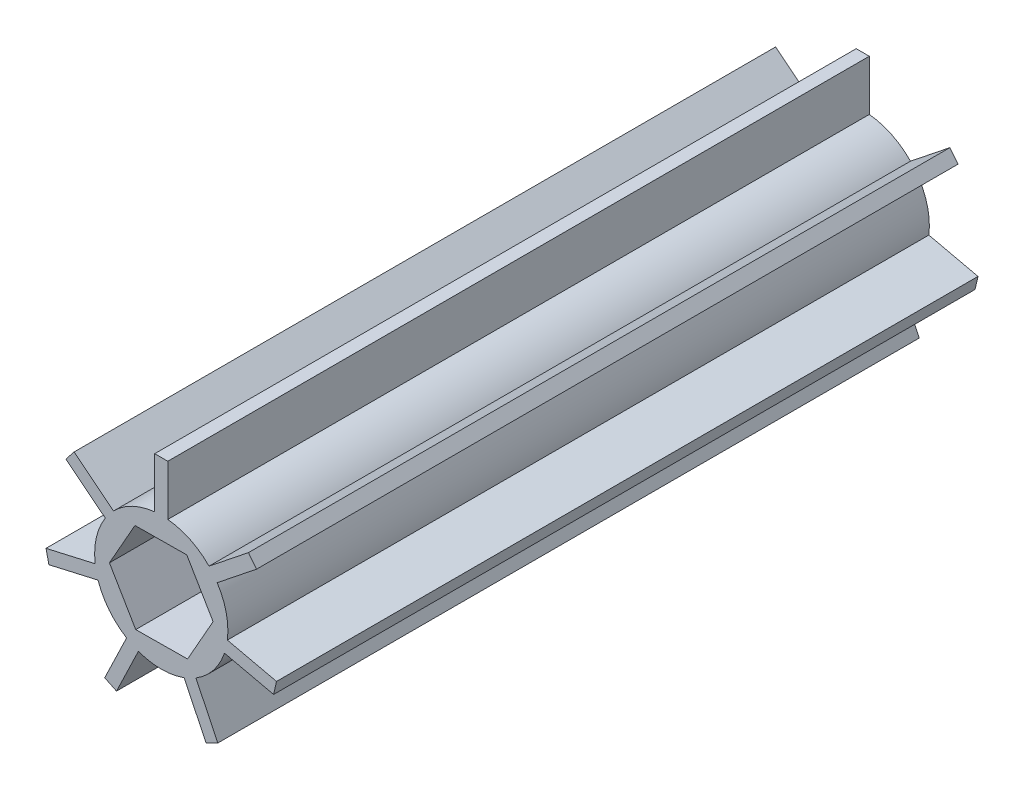
ISO-10303-21;
HEADER;
FILE_DESCRIPTION(('STEP AP214'),'2;1');
FILE_NAME('part.step','',(''),(''),'','','');
FILE_SCHEMA(('AUTOMOTIVE_DESIGN { 1 0 10303 214 1 1 1 1 }'));
ENDSEC;
DATA;
#1=APPLICATION_CONTEXT('core data for automotive mechanical design processes');
#2=APPLICATION_PROTOCOL_DEFINITION('international standard','automotive_design',2000,#1);
#3=PRODUCT_CONTEXT('',#1,'mechanical');
#4=PRODUCT('Part','Part','',(#3));
#5=PRODUCT_RELATED_PRODUCT_CATEGORY('part','',(#4));
#6=PRODUCT_DEFINITION_FORMATION('','',#4);
#7=PRODUCT_DEFINITION_CONTEXT('part definition',#1,'design');
#8=PRODUCT_DEFINITION('design','',#6,#7);
#9=PRODUCT_DEFINITION_SHAPE('','',#8);
#10=(LENGTH_UNIT() NAMED_UNIT(*) SI_UNIT(.MILLI.,.METRE.));
#11=(NAMED_UNIT(*) PLANE_ANGLE_UNIT() SI_UNIT($,.RADIAN.));
#12=(NAMED_UNIT(*) SI_UNIT($,.STERADIAN.) SOLID_ANGLE_UNIT());
#13=UNCERTAINTY_MEASURE_WITH_UNIT(LENGTH_MEASURE(1.E-05),#10,'distance_accuracy_value','');
#14=(GEOMETRIC_REPRESENTATION_CONTEXT(3) GLOBAL_UNCERTAINTY_ASSIGNED_CONTEXT((#13)) GLOBAL_UNIT_ASSIGNED_CONTEXT((#10,
#11,#12)) REPRESENTATION_CONTEXT('',''));
#15=CARTESIAN_POINT('',(0.,0.,0.));
#16=DIRECTION('',(0.,0.,1.));
#17=DIRECTION('',(1.,0.,0.));
#18=AXIS2_PLACEMENT_3D('',#15,#16,#17);
#19=CARTESIAN_POINT('',(0.,0.,-76.2));
#20=DIRECTION('',(0.,0.,1.));
#21=DIRECTION('',(1.,0.,0.));
#22=AXIS2_PLACEMENT_3D('',#19,#20,#21);
#23=CYLINDRICAL_SURFACE('',#22,7.239);
#24=DIRECTION('',(0.,0.,1.));
#25=VECTOR('',#24,1.);
#26=CARTESIAN_POINT('',(-5.1888717496062,5.04764608170369,-76.2));
#27=LINE('',#26,#25);
#28=CARTESIAN_POINT('',(-5.18887174960621,5.04764608170369,0.));
#29=VERTEX_POINT('',#28);
#30=CARTESIAN_POINT('',(-5.18887174960621,5.04764608170369,-76.2));
#31=VERTEX_POINT('',#30);
#32=EDGE_CURVE('E11',#29,#31,#27,.F.);
#33=ORIENTED_EDGE('',*,*,#32,.F.);
#34=CARTESIAN_POINT('',(0.,0.,0.));
#35=DIRECTION('',(0.,0.,1.));
#36=DIRECTION('',(1.,0.,0.));
#37=AXIS2_PLACEMENT_3D('',#34,#35,#36);
#38=CIRCLE('',#37,7.239);
#39=CARTESIAN_POINT('',(-0.7112,7.20397914766555,0.));
#40=VERTEX_POINT('',#39);
#41=EDGE_CURVE('E442',#40,#29,#38,.T.);
#42=ORIENTED_EDGE('',*,*,#41,.F.);
#43=DIRECTION('',(0.,0.,1.));
#44=VECTOR('',#43,1.);
#45=CARTESIAN_POINT('',(-0.7112,7.20397914766554,-76.2));
#46=LINE('',#45,#44);
#47=CARTESIAN_POINT('',(-0.7112,7.20397914766555,-76.2));
#48=VERTEX_POINT('',#47);
#49=EDGE_CURVE('E439',#40,#48,#46,.F.);
#50=ORIENTED_EDGE('',*,*,#49,.T.);
#51=CARTESIAN_POINT('',(0.,0.,-76.2));
#52=DIRECTION('',(0.,0.,1.));
#53=DIRECTION('',(1.,0.,0.));
#54=AXIS2_PLACEMENT_3D('',#51,#52,#53);
#55=CIRCLE('',#54,7.239);
#56=EDGE_CURVE('E436',#48,#31,#55,.T.);
#57=ORIENTED_EDGE('',*,*,#56,.T.);
#58=EDGE_LOOP('',(#33,#42,#50,#57));
#59=FACE_BOUND('',#58,.T.);
#60=ADVANCED_FACE('F39',(#59),#23,.T.);
#61=DIRECTION('',(0.,0.,1.));
#62=VECTOR('',#61,1.);
#63=CARTESIAN_POINT('',(-6.07572364377006,3.93556898104116,-76.2));
#64=LINE('',#63,#62);
#65=CARTESIAN_POINT('',(-6.07572364377007,3.93556898104116,-76.2));
#66=VERTEX_POINT('',#65);
#67=CARTESIAN_POINT('',(-6.07572364377007,3.93556898104116,0.));
#68=VERTEX_POINT('',#67);
#69=EDGE_CURVE('E47',#66,#68,#64,.T.);
#70=ORIENTED_EDGE('',*,*,#69,.F.);
#71=CARTESIAN_POINT('',(-7.18161723806469,-0.909667436996666,-76.2));
#72=VERTEX_POINT('',#71);
#73=EDGE_CURVE('E440',#66,#72,#55,.T.);
#74=ORIENTED_EDGE('',*,*,#73,.T.);
#75=DIRECTION('',(0.,0.,1.));
#76=VECTOR('',#75,1.);
#77=CARTESIAN_POINT('',(-7.18161723806469,-0.909667436996666,-76.2));
#78=LINE('',#77,#76);
#79=CARTESIAN_POINT('',(-7.18161723806469,-0.909667436996666,0.));
#80=VERTEX_POINT('',#79);
#81=EDGE_CURVE('E498',#80,#72,#78,.F.);
#82=ORIENTED_EDGE('',*,*,#81,.F.);
#83=EDGE_CURVE('E445',#68,#80,#38,.T.);
#84=ORIENTED_EDGE('',*,*,#83,.F.);
#85=EDGE_LOOP('',(#70,#74,#82,#84));
#86=FACE_BOUND('',#85,.T.);
#87=ADVANCED_FACE('F510',(#86),#23,.T.);
#88=DIRECTION('',(0.,0.,1.));
#89=VECTOR('',#88,1.);
#90=CARTESIAN_POINT('',(-6.86510346160522,-2.29640489928409,-76.2));
#91=LINE('',#90,#89);
#92=CARTESIAN_POINT('',(-6.86510346160522,-2.29640489928409,-76.2));
#93=VERTEX_POINT('',#92);
#94=CARTESIAN_POINT('',(-6.86510346160522,-2.29640489928409,0.));
#95=VERTEX_POINT('',#94);
#96=EDGE_CURVE('E495',#93,#95,#91,.T.);
#97=ORIENTED_EDGE('',*,*,#96,.F.);
#98=CARTESIAN_POINT('',(-3.76645846796621,-6.18198282180448,-76.2));
#99=VERTEX_POINT('',#98);
#100=EDGE_CURVE('E557',#93,#99,#55,.T.);
#101=ORIENTED_EDGE('',*,*,#100,.T.);
#102=DIRECTION('',(0.,0.,1.));
#103=VECTOR('',#102,1.);
#104=CARTESIAN_POINT('',(-3.76645846796621,-6.18198282180448,-76.2));
#105=LINE('',#104,#103);
#106=CARTESIAN_POINT('',(-3.76645846796621,-6.18198282180448,0.));
#107=VERTEX_POINT('',#106);
#108=EDGE_CURVE('E492',#107,#99,#105,.F.);
#109=ORIENTED_EDGE('',*,*,#108,.F.);
#110=EDGE_CURVE('E513',#95,#107,#38,.T.);
#111=ORIENTED_EDGE('',*,*,#110,.F.);
#112=EDGE_LOOP('',(#97,#101,#109,#111));
#113=FACE_BOUND('',#112,.T.);
#114=ADVANCED_FACE('F597',(#113),#23,.T.);
#115=DIRECTION('',(0.,0.,1.));
#116=VECTOR('',#115,1.);
#117=CARTESIAN_POINT('',(-2.4849203502618,-6.79913905232528,-76.2));
#118=LINE('',#117,#116);
#119=CARTESIAN_POINT('',(-2.4849203502618,-6.79913905232528,-76.2));
#120=VERTEX_POINT('',#119);
#121=CARTESIAN_POINT('',(-2.4849203502618,-6.79913905232528,0.));
#122=VERTEX_POINT('',#121);
#123=EDGE_CURVE('E489',#120,#122,#118,.T.);
#124=ORIENTED_EDGE('',*,*,#123,.F.);
#125=CARTESIAN_POINT('',(2.4849203502619,-6.79913905232525,-76.2));
#126=VERTEX_POINT('',#125);
#127=EDGE_CURVE('E558',#120,#126,#55,.T.);
#128=ORIENTED_EDGE('',*,*,#127,.T.);
#129=DIRECTION('',(0.,0.,1.));
#130=VECTOR('',#129,1.);
#131=CARTESIAN_POINT('',(2.4849203502619,-6.79913905232525,-76.2));
#132=LINE('',#131,#130);
#133=CARTESIAN_POINT('',(2.4849203502619,-6.79913905232525,0.));
#134=VERTEX_POINT('',#133);
#135=EDGE_CURVE('E486',#134,#126,#132,.F.);
#136=ORIENTED_EDGE('',*,*,#135,.F.);
#137=EDGE_CURVE('E515',#122,#134,#38,.T.);
#138=ORIENTED_EDGE('',*,*,#137,.F.);
#139=EDGE_LOOP('',(#124,#128,#136,#138));
#140=FACE_BOUND('',#139,.T.);
#141=ADVANCED_FACE('F612',(#140),#23,.T.);
#142=DIRECTION('',(0.,0.,1.));
#143=VECTOR('',#142,1.);
#144=CARTESIAN_POINT('',(3.7664584679663,-6.18198282180442,-76.2));
#145=LINE('',#144,#143);
#146=CARTESIAN_POINT('',(3.7664584679663,-6.18198282180442,-76.2));
#147=VERTEX_POINT('',#146);
#148=CARTESIAN_POINT('',(3.7664584679663,-6.18198282180442,0.));
#149=VERTEX_POINT('',#148);
#150=EDGE_CURVE('E483',#147,#149,#145,.T.);
#151=ORIENTED_EDGE('',*,*,#150,.F.);
#152=CARTESIAN_POINT('',(6.86510346160525,-2.296404899284,-76.2));
#153=VERTEX_POINT('',#152);
#154=EDGE_CURVE('E561',#147,#153,#55,.T.);
#155=ORIENTED_EDGE('',*,*,#154,.T.);
#156=DIRECTION('',(0.,0.,1.));
#157=VECTOR('',#156,1.);
#158=CARTESIAN_POINT('',(6.86510346160525,-2.296404899284,-76.2));
#159=LINE('',#158,#157);
#160=CARTESIAN_POINT('',(6.86510346160525,-2.296404899284,0.));
#161=VERTEX_POINT('',#160);
#162=EDGE_CURVE('E480',#161,#153,#159,.F.);
#163=ORIENTED_EDGE('',*,*,#162,.F.);
#164=EDGE_CURVE('E518',#149,#161,#38,.T.);
#165=ORIENTED_EDGE('',*,*,#164,.F.);
#166=EDGE_LOOP('',(#151,#155,#163,#165));
#167=FACE_BOUND('',#166,.T.);
#168=ADVANCED_FACE('F607',(#167),#23,.T.);
#169=DIRECTION('',(0.,0.,1.));
#170=VECTOR('',#169,1.);
#171=CARTESIAN_POINT('',(7.1816172380647,-0.909667436996568,-76.2));
#172=LINE('',#171,#170);
#173=CARTESIAN_POINT('',(7.1816172380647,-0.909667436996569,-76.2));
#174=VERTEX_POINT('',#173);
#175=CARTESIAN_POINT('',(7.1816172380647,-0.909667436996568,0.));
#176=VERTEX_POINT('',#175);
#177=EDGE_CURVE('E477',#174,#176,#172,.T.);
#178=ORIENTED_EDGE('',*,*,#177,.F.);
#179=CARTESIAN_POINT('',(6.07572364377001,3.93556898104125,-76.2));
#180=VERTEX_POINT('',#179);
#181=EDGE_CURVE('E564',#174,#180,#55,.T.);
#182=ORIENTED_EDGE('',*,*,#181,.T.);
#183=DIRECTION('',(0.,0.,1.));
#184=VECTOR('',#183,1.);
#185=CARTESIAN_POINT('',(6.07572364377001,3.93556898104125,-76.2));
#186=LINE('',#185,#184);
#187=CARTESIAN_POINT('',(6.07572364377001,3.93556898104125,0.));
#188=VERTEX_POINT('',#187);
#189=EDGE_CURVE('E474',#188,#180,#186,.F.);
#190=ORIENTED_EDGE('',*,*,#189,.F.);
#191=EDGE_CURVE('E521',#176,#188,#38,.T.);
#192=ORIENTED_EDGE('',*,*,#191,.F.);
#193=EDGE_LOOP('',(#178,#182,#190,#192));
#194=FACE_BOUND('',#193,.T.);
#195=ADVANCED_FACE('F569',(#194),#23,.T.);
#196=CARTESIAN_POINT('',(0.7112,0.,-76.2));
#197=DIRECTION('',(1.,0.,0.));
#198=DIRECTION('',(0.,0.,-1.));
#199=AXIS2_PLACEMENT_3D('',#196,#197,#198);
#200=PLANE('',#199);
#201=DIRECTION('',(0.,0.,1.));
#202=VECTOR('',#201,1.);
#203=CARTESIAN_POINT('',(0.7112,7.20397914766554,-76.2));
#204=LINE('',#203,#202);
#205=CARTESIAN_POINT('',(0.7112,7.20397914766555,-76.2));
#206=VERTEX_POINT('',#205);
#207=CARTESIAN_POINT('',(0.7112,7.20397914766555,0.));
#208=VERTEX_POINT('',#207);
#209=EDGE_CURVE('E447',#206,#208,#204,.T.);
#210=ORIENTED_EDGE('',*,*,#209,.F.);
#211=DIRECTION('',(0.,1.,0.));
#212=VECTOR('',#211,1.);
#213=CARTESIAN_POINT('',(0.7112,0.,-76.2));
#214=LINE('',#213,#212);
#215=CARTESIAN_POINT('',(0.7112,12.6800707632095,-76.2));
#216=VERTEX_POINT('',#215);
#217=EDGE_CURVE('E451',#206,#216,#214,.T.);
#218=ORIENTED_EDGE('',*,*,#217,.T.);
#219=DIRECTION('',(0.,0.,1.));
#220=VECTOR('',#219,1.);
#221=CARTESIAN_POINT('',(0.7112,12.6800707632095,-76.2));
#222=LINE('',#221,#220);
#223=CARTESIAN_POINT('',(0.7112,12.6800707632095,0.));
#224=VERTEX_POINT('',#223);
#225=EDGE_CURVE('E460',#216,#224,#222,.T.);
#226=ORIENTED_EDGE('',*,*,#225,.T.);
#227=DIRECTION('',(0.,1.,0.));
#228=VECTOR('',#227,1.);
#229=CARTESIAN_POINT('',(0.7112,0.,0.));
#230=LINE('',#229,#228);
#231=EDGE_CURVE('E450',#208,#224,#230,.T.);
#232=ORIENTED_EDGE('',*,*,#231,.F.);
#233=EDGE_LOOP('',(#210,#218,#226,#232));
#234=FACE_BOUND('',#233,.T.);
#235=ADVANCED_FACE('F41',(#234),#200,.T.);
#236=CARTESIAN_POINT('',(-0.7112,0.,-76.2));
#237=DIRECTION('',(-1.,0.,0.));
#238=DIRECTION('',(0.,0.,1.));
#239=AXIS2_PLACEMENT_3D('',#236,#237,#238);
#240=PLANE('',#239);
#241=ORIENTED_EDGE('',*,*,#49,.F.);
#242=DIRECTION('',(0.,-1.,0.));
#243=VECTOR('',#242,1.);
#244=CARTESIAN_POINT('',(-0.7112,0.,0.));
#245=LINE('',#244,#243);
#246=CARTESIAN_POINT('',(-0.7112,12.6800707632095,0.));
#247=VERTEX_POINT('',#246);
#248=EDGE_CURVE('E454',#247,#40,#245,.T.);
#249=ORIENTED_EDGE('',*,*,#248,.F.);
#250=DIRECTION('',(0.,0.,1.));
#251=VECTOR('',#250,1.);
#252=CARTESIAN_POINT('',(-0.7112,12.6800707632095,-76.2));
#253=LINE('',#252,#251);
#254=CARTESIAN_POINT('',(-0.7112,12.6800707632095,-76.2));
#255=VERTEX_POINT('',#254);
#256=EDGE_CURVE('E467',#255,#247,#253,.T.);
#257=ORIENTED_EDGE('',*,*,#256,.F.);
#258=DIRECTION('',(0.,-1.,0.));
#259=VECTOR('',#258,1.);
#260=CARTESIAN_POINT('',(-0.7112,0.,-76.2));
#261=LINE('',#260,#259);
#262=EDGE_CURVE('E457',#255,#48,#261,.T.);
#263=ORIENTED_EDGE('',*,*,#262,.T.);
#264=EDGE_LOOP('',(#241,#249,#257,#263));
#265=FACE_BOUND('',#264,.T.);
#266=ADVANCED_FACE('F542',(#265),#240,.T.);
#267=CARTESIAN_POINT('',(-0.7112,12.6800707632095,-76.2));
#268=DIRECTION('',(0.,1.,0.));
#269=DIRECTION('',(0.,0.,1.));
#270=AXIS2_PLACEMENT_3D('',#267,#268,#269);
#271=PLANE('',#270);
#272=DIRECTION('',(-1.,0.,0.));
#273=VECTOR('',#272,1.);
#274=CARTESIAN_POINT('',(-0.7112,12.6800707632095,0.));
#275=LINE('',#274,#273);
#276=EDGE_CURVE('E462',#224,#247,#275,.T.);
#277=ORIENTED_EDGE('',*,*,#276,.F.);
#278=ORIENTED_EDGE('',*,*,#225,.F.);
#279=DIRECTION('',(-1.,0.,0.));
#280=VECTOR('',#279,1.);
#281=CARTESIAN_POINT('',(-0.7112,12.6800707632095,-76.2));
#282=LINE('',#281,#280);
#283=EDGE_CURVE('E453',#216,#255,#282,.T.);
#284=ORIENTED_EDGE('',*,*,#283,.T.);
#285=ORIENTED_EDGE('',*,*,#256,.T.);
#286=EDGE_LOOP('',(#277,#278,#284,#285));
#287=FACE_BOUND('',#286,.T.);
#288=ADVANCED_FACE('F538',(#287),#271,.T.);
#289=CARTESIAN_POINT('',(0.,0.,-76.2));
#290=DIRECTION('',(0.,0.,-1.));
#291=DIRECTION('',(-1.,0.,0.));
#292=AXIS2_PLACEMENT_3D('',#289,#290,#291);
#293=PLANE('',#292);
#294=DIRECTION('',(0.492619747113076,0.870244669477641,0.));
#295=VECTOR('',#294,1.);
#296=CARTESIAN_POINT('',(2.85697830858125,-4.85268783915638,-76.2));
#297=LINE('',#296,#295);
#298=CARTESIAN_POINT('',(2.85697830858125,-4.85268783915638,-76.2));
#299=VERTEX_POINT('',#298);
#300=CARTESIAN_POINT('',(5.63104009963586,0.047871873714276,-76.2));
#301=VERTEX_POINT('',#300);
#302=EDGE_CURVE('E261',#299,#301,#297,.T.);
#303=ORIENTED_EDGE('',*,*,#302,.T.);
#304=DIRECTION('',(-0.507344117719091,0.861743550144611,0.));
#305=VECTOR('',#304,1.);
#306=CARTESIAN_POINT('',(5.63104009963586,0.047871873714276,-76.2));
#307=LINE('',#306,#305);
#308=CARTESIAN_POINT('',(2.77406179105461,4.90055971287065,-76.2));
#309=VERTEX_POINT('',#308);
#310=EDGE_CURVE('E270',#301,#309,#307,.T.);
#311=ORIENTED_EDGE('',*,*,#310,.T.);
#312=DIRECTION('',(-0.999963864832168,-0.00850111933302995,0.));
#313=VECTOR('',#312,1.);
#314=CARTESIAN_POINT('',(2.77406179105461,4.90055971287065,-76.2));
#315=LINE('',#314,#313);
#316=CARTESIAN_POINT('',(-2.85697830858125,4.85268783915638,-76.2));
#317=VERTEX_POINT('',#316);
#318=EDGE_CURVE('E54',#309,#317,#315,.T.);
#319=ORIENTED_EDGE('',*,*,#318,.T.);
#320=DIRECTION('',(-0.492619747113076,-0.870244669477641,0.));
#321=VECTOR('',#320,1.);
#322=CARTESIAN_POINT('',(-2.85697830858125,4.85268783915638,-76.2));
#323=LINE('',#322,#321);
#324=CARTESIAN_POINT('',(-5.63104009963586,-0.0478718737142743,-76.2));
#325=VERTEX_POINT('',#324);
#326=EDGE_CURVE('E285',#317,#325,#323,.T.);
#327=ORIENTED_EDGE('',*,*,#326,.T.);
#328=DIRECTION('',(0.507344117719091,-0.861743550144611,0.));
#329=VECTOR('',#328,1.);
#330=CARTESIAN_POINT('',(-5.63104009963586,-0.0478718737142743,-76.2));
#331=LINE('',#330,#329);
#332=CARTESIAN_POINT('',(-2.77406179105461,-4.90055971287065,-76.2));
#333=VERTEX_POINT('',#332);
#334=EDGE_CURVE('E288',#325,#333,#331,.T.);
#335=ORIENTED_EDGE('',*,*,#334,.T.);
#336=DIRECTION('',(0.999963864832168,0.00850111933303011,0.));
#337=VECTOR('',#336,1.);
#338=CARTESIAN_POINT('',(-2.77406179105461,-4.90055971287065,-76.2));
#339=LINE('',#338,#337);
#340=EDGE_CURVE('E267',#333,#299,#339,.T.);
#341=ORIENTED_EDGE('',*,*,#340,.T.);
#342=EDGE_LOOP('',(#303,#311,#319,#327,#335,#341));
#343=FACE_BOUND('',#342,.T.);
#344=ORIENTED_EDGE('',*,*,#73,.F.);
#345=DIRECTION('',(0.781831482468031,-0.623489801858732,0.));
#346=VECTOR('',#345,1.);
#347=CARTESIAN_POINT('',(-0.44342594708193,-0.556038550331264,-76.2));
#348=LINE('',#347,#346);
#349=CARTESIAN_POINT('',(-10.3571044696815,7.34985625737692,-76.2));
#350=VERTEX_POINT('',#349);
#351=EDGE_CURVE('E423',#350,#66,#348,.T.);
#352=ORIENTED_EDGE('',*,*,#351,.F.);
#353=DIRECTION('',(-0.623489801858732,-0.781831482468031,0.));
#354=VECTOR('',#353,1.);
#355=CARTESIAN_POINT('',(-10.3571044696815,7.34985625737692,-76.2));
#356=LINE('',#355,#354);
#357=CARTESIAN_POINT('',(-9.47025257551768,8.46193335803945,-76.2));
#358=VERTEX_POINT('',#357);
#359=EDGE_CURVE('E419',#358,#350,#356,.T.);
#360=ORIENTED_EDGE('',*,*,#359,.F.);
#361=DIRECTION('',(-0.781831482468031,0.623489801858732,0.));
#362=VECTOR('',#361,1.);
#363=CARTESIAN_POINT('',(0.44342594708193,0.556038550331264,-76.2));
#364=LINE('',#363,#362);
#365=EDGE_CURVE('E417',#31,#358,#364,.T.);
#366=ORIENTED_EDGE('',*,*,#365,.F.);
#367=ORIENTED_EDGE('',*,*,#56,.F.);
#368=ORIENTED_EDGE('',*,*,#262,.F.);
#369=ORIENTED_EDGE('',*,*,#283,.F.);
#370=ORIENTED_EDGE('',*,*,#217,.F.);
#371=CARTESIAN_POINT('',(5.18887174960613,5.04764608170376,-76.2));
#372=VERTEX_POINT('',#371);
#373=EDGE_CURVE('E441',#372,#206,#55,.T.);
#374=ORIENTED_EDGE('',*,*,#373,.F.);
#375=DIRECTION('',(-0.781831482468022,-0.623489801858743,0.));
#376=VECTOR('',#375,1.);
#377=CARTESIAN_POINT('',(-0.443425947081938,0.556038550331257,-76.2));
#378=LINE('',#377,#376);
#379=CARTESIAN_POINT('',(9.47025257551756,8.46193335803958,-76.2));
#380=VERTEX_POINT('',#379);
#381=EDGE_CURVE('E318',#380,#372,#378,.T.);
#382=ORIENTED_EDGE('',*,*,#381,.F.);
#383=DIRECTION('',(-0.623489801858743,0.781831482468022,0.));
#384=VECTOR('',#383,1.);
#385=CARTESIAN_POINT('',(9.47025257551756,8.46193335803958,-76.2));
#386=LINE('',#385,#384);
#387=CARTESIAN_POINT('',(10.3571044696814,7.34985625737707,-76.2));
#388=VERTEX_POINT('',#387);
#389=EDGE_CURVE('E314',#388,#380,#386,.T.);
#390=ORIENTED_EDGE('',*,*,#389,.F.);
#391=DIRECTION('',(0.781831482468022,0.623489801858743,0.));
#392=VECTOR('',#391,1.);
#393=CARTESIAN_POINT('',(0.443425947081938,-0.556038550331257,-76.2));
#394=LINE('',#393,#392);
#395=EDGE_CURVE('E312',#180,#388,#394,.T.);
#396=ORIENTED_EDGE('',*,*,#395,.F.);
#397=ORIENTED_EDGE('',*,*,#181,.F.);
#398=DIRECTION('',(-0.974927912181826,0.222520933956305,0.));
#399=VECTOR('',#398,1.);
#400=CARTESIAN_POINT('',(0.158256888229724,0.693368731143715,-76.2));
#401=LINE('',#400,#399);
#402=CARTESIAN_POINT('',(12.5204118037234,-2.1282124577177,-76.2));
#403=VERTEX_POINT('',#402);
#404=EDGE_CURVE('E339',#403,#174,#401,.T.);
#405=ORIENTED_EDGE('',*,*,#404,.F.);
#406=DIRECTION('',(0.222520933956305,0.974927912181826,0.));
#407=VECTOR('',#406,1.);
#408=CARTESIAN_POINT('',(12.5204118037234,-2.1282124577177,-76.2));
#409=LINE('',#408,#407);
#410=CARTESIAN_POINT('',(12.2038980272639,-3.51494992000513,-76.2));
#411=VERTEX_POINT('',#410);
#412=EDGE_CURVE('E335',#411,#403,#409,.T.);
#413=ORIENTED_EDGE('',*,*,#412,.F.);
#414=DIRECTION('',(0.974927912181826,-0.222520933956305,0.));
#415=VECTOR('',#414,1.);
#416=CARTESIAN_POINT('',(-0.158256888229724,-0.693368731143714,-76.2));
#417=LINE('',#416,#415);
#418=EDGE_CURVE('E333',#153,#411,#417,.T.);
#419=ORIENTED_EDGE('',*,*,#418,.F.);
#420=ORIENTED_EDGE('',*,*,#154,.F.);
#421=DIRECTION('',(-0.433883739117565,0.900968867902416,0.));
#422=VECTOR('',#421,1.);
#423=CARTESIAN_POINT('',(0.640769058852198,0.308578115260412,-76.2));
#424=LINE('',#423,#422);
#425=CARTESIAN_POINT('',(6.14244557386885,-11.115770885191,-76.2));
#426=VERTEX_POINT('',#425);
#427=EDGE_CURVE('E360',#426,#147,#424,.T.);
#428=ORIENTED_EDGE('',*,*,#427,.F.);
#429=DIRECTION('',(0.900968867902416,0.433883739117565,0.));
#430=VECTOR('',#429,1.);
#431=CARTESIAN_POINT('',(6.14244557386885,-11.115770885191,-76.2));
#432=LINE('',#431,#430);
#433=CARTESIAN_POINT('',(4.86090745616445,-11.7329271157118,-76.2));
#434=VERTEX_POINT('',#433);
#435=EDGE_CURVE('E356',#434,#426,#432,.T.);
#436=ORIENTED_EDGE('',*,*,#435,.F.);
#437=DIRECTION('',(0.433883739117565,-0.900968867902416,0.));
#438=VECTOR('',#437,1.);
#439=CARTESIAN_POINT('',(-0.640769058852198,-0.308578115260412,-76.2));
#440=LINE('',#439,#438);
#441=EDGE_CURVE('E354',#126,#434,#440,.T.);
#442=ORIENTED_EDGE('',*,*,#441,.F.);
#443=ORIENTED_EDGE('',*,*,#127,.F.);
#444=DIRECTION('',(0.433883739117553,0.900968867902422,0.));
#445=VECTOR('',#444,1.);
#446=CARTESIAN_POINT('',(0.640769058852203,-0.308578115260403,-76.2));
#447=LINE('',#446,#445);
#448=CARTESIAN_POINT('',(-4.86090745616429,-11.7329271157119,-76.2));
#449=VERTEX_POINT('',#448);
#450=EDGE_CURVE('E381',#449,#120,#447,.T.);
#451=ORIENTED_EDGE('',*,*,#450,.F.);
#452=DIRECTION('',(0.900968867902422,-0.433883739117553,0.));
#453=VECTOR('',#452,1.);
#454=CARTESIAN_POINT('',(-4.86090745616429,-11.7329271157119,-76.2));
#455=LINE('',#454,#453);
#456=CARTESIAN_POINT('',(-6.14244557386869,-11.115770885191,-76.2));
#457=VERTEX_POINT('',#456);
#458=EDGE_CURVE('E377',#457,#449,#455,.T.);
#459=ORIENTED_EDGE('',*,*,#458,.F.);
#460=DIRECTION('',(-0.433883739117553,-0.900968867902422,0.));
#461=VECTOR('',#460,1.);
#462=CARTESIAN_POINT('',(-0.640769058852202,0.308578115260403,-76.2));
#463=LINE('',#462,#461);
#464=EDGE_CURVE('E375',#99,#457,#463,.T.);
#465=ORIENTED_EDGE('',*,*,#464,.F.);
#466=ORIENTED_EDGE('',*,*,#100,.F.);
#467=DIRECTION('',(0.974927912181823,0.222520933956318,0.));
#468=VECTOR('',#467,1.);
#469=CARTESIAN_POINT('',(0.158256888229734,-0.693368731143712,-76.2));
#470=LINE('',#469,#468);
#471=CARTESIAN_POINT('',(-12.2038980272639,-3.51494992000529,-76.2));
#472=VERTEX_POINT('',#471);
#473=EDGE_CURVE('E402',#472,#93,#470,.T.);
#474=ORIENTED_EDGE('',*,*,#473,.F.);
#475=DIRECTION('',(0.222520933956318,-0.974927912181823,0.));
#476=VECTOR('',#475,1.);
#477=CARTESIAN_POINT('',(-12.2038980272639,-3.51494992000529,-76.2));
#478=LINE('',#477,#476);
#479=CARTESIAN_POINT('',(-12.5204118037233,-2.12821245771787,-76.2));
#480=VERTEX_POINT('',#479);
#481=EDGE_CURVE('E398',#480,#472,#478,.T.);
#482=ORIENTED_EDGE('',*,*,#481,.F.);
#483=DIRECTION('',(-0.974927912181823,-0.222520933956318,0.));
#484=VECTOR('',#483,1.);
#485=CARTESIAN_POINT('',(-0.158256888229734,0.693368731143712,-76.2));
#486=LINE('',#485,#484);
#487=EDGE_CURVE('E396',#72,#480,#486,.T.);
#488=ORIENTED_EDGE('',*,*,#487,.F.);
#489=EDGE_LOOP('',(#344,#352,#360,#366,#367,#368,#369,#370,#374,#382,#390,#396,#397,#405,#413,
#419,#420,#428,#436,#442,#443,#451,#459,#465,#466,#474,#482,#488));
#490=FACE_BOUND('',#489,.T.);
#491=ADVANCED_FACE('F274',(#343,#490),#293,.T.);
#492=CARTESIAN_POINT('',(0.,0.,0.));
#493=DIRECTION('',(0.,0.,-1.));
#494=DIRECTION('',(-1.,0.,0.));
#495=AXIS2_PLACEMENT_3D('',#492,#493,#494);
#496=PLANE('',#495);
#497=DIRECTION('',(-0.507344117719091,0.861743550144611,0.));
#498=VECTOR('',#497,1.);
#499=CARTESIAN_POINT('',(5.63104009963586,0.047871873714276,0.));
#500=LINE('',#499,#498);
#501=CARTESIAN_POINT('',(5.63104009963586,0.0478718737142755,0.));
#502=VERTEX_POINT('',#501);
#503=CARTESIAN_POINT('',(2.77406179105461,4.90055971287065,0.));
#504=VERTEX_POINT('',#503);
#505=EDGE_CURVE('E292',#502,#504,#500,.T.);
#506=ORIENTED_EDGE('',*,*,#505,.F.);
#507=DIRECTION('',(0.492619747113076,0.870244669477641,0.));
#508=VECTOR('',#507,1.);
#509=CARTESIAN_POINT('',(2.85697830858125,-4.85268783915638,0.));
#510=LINE('',#509,#508);
#511=CARTESIAN_POINT('',(2.85697830858125,-4.85268783915638,0.));
#512=VERTEX_POINT('',#511);
#513=EDGE_CURVE('E62',#512,#502,#510,.T.);
#514=ORIENTED_EDGE('',*,*,#513,.F.);
#515=DIRECTION('',(0.999963864832168,0.00850111933303011,0.));
#516=VECTOR('',#515,1.);
#517=CARTESIAN_POINT('',(-2.77406179105461,-4.90055971287065,0.));
#518=LINE('',#517,#516);
#519=CARTESIAN_POINT('',(-2.77406179105461,-4.90055971287065,0.));
#520=VERTEX_POINT('',#519);
#521=EDGE_CURVE('E278',#520,#512,#518,.T.);
#522=ORIENTED_EDGE('',*,*,#521,.F.);
#523=DIRECTION('',(0.507344117719091,-0.861743550144611,0.));
#524=VECTOR('',#523,1.);
#525=CARTESIAN_POINT('',(-5.63104009963586,-0.0478718737142743,0.));
#526=LINE('',#525,#524);
#527=CARTESIAN_POINT('',(-5.63104009963586,-0.0478718737142743,0.));
#528=VERTEX_POINT('',#527);
#529=EDGE_CURVE('E281',#528,#520,#526,.T.);
#530=ORIENTED_EDGE('',*,*,#529,.F.);
#531=DIRECTION('',(-0.492619747113076,-0.870244669477641,0.));
#532=VECTOR('',#531,1.);
#533=CARTESIAN_POINT('',(-2.85697830858125,4.85268783915638,0.));
#534=LINE('',#533,#532);
#535=CARTESIAN_POINT('',(-2.85697830858125,4.85268783915638,0.));
#536=VERTEX_POINT('',#535);
#537=EDGE_CURVE('E297',#536,#528,#534,.T.);
#538=ORIENTED_EDGE('',*,*,#537,.F.);
#539=DIRECTION('',(-0.999963864832168,-0.00850111933302995,0.));
#540=VECTOR('',#539,1.);
#541=CARTESIAN_POINT('',(2.77406179105461,4.90055971287065,0.));
#542=LINE('',#541,#540);
#543=EDGE_CURVE('E294',#504,#536,#542,.T.);
#544=ORIENTED_EDGE('',*,*,#543,.F.);
#545=EDGE_LOOP('',(#506,#514,#522,#530,#538,#544));
#546=FACE_BOUND('',#545,.T.);
#547=DIRECTION('',(0.781831482468031,-0.623489801858732,0.));
#548=VECTOR('',#547,1.);
#549=CARTESIAN_POINT('',(-0.44342594708193,-0.556038550331264,0.));
#550=LINE('',#549,#548);
#551=CARTESIAN_POINT('',(-10.3571044696815,7.34985625737692,0.));
#552=VERTEX_POINT('',#551);
#553=EDGE_CURVE('E420',#552,#68,#550,.T.);
#554=ORIENTED_EDGE('',*,*,#553,.T.);
#555=ORIENTED_EDGE('',*,*,#83,.T.);
#556=DIRECTION('',(-0.974927912181823,-0.222520933956318,0.));
#557=VECTOR('',#556,1.);
#558=CARTESIAN_POINT('',(-0.158256888229734,0.693368731143712,0.));
#559=LINE('',#558,#557);
#560=CARTESIAN_POINT('',(-12.5204118037233,-2.12821245771787,0.));
#561=VERTEX_POINT('',#560);
#562=EDGE_CURVE('E393',#80,#561,#559,.T.);
#563=ORIENTED_EDGE('',*,*,#562,.T.);
#564=DIRECTION('',(0.222520933956318,-0.974927912181823,0.));
#565=VECTOR('',#564,1.);
#566=CARTESIAN_POINT('',(-12.2038980272639,-3.51494992000529,0.));
#567=LINE('',#566,#565);
#568=CARTESIAN_POINT('',(-12.2038980272639,-3.51494992000529,0.));
#569=VERTEX_POINT('',#568);
#570=EDGE_CURVE('E407',#561,#569,#567,.T.);
#571=ORIENTED_EDGE('',*,*,#570,.T.);
#572=DIRECTION('',(0.974927912181823,0.222520933956318,0.));
#573=VECTOR('',#572,1.);
#574=CARTESIAN_POINT('',(0.158256888229734,-0.693368731143712,0.));
#575=LINE('',#574,#573);
#576=EDGE_CURVE('E399',#569,#95,#575,.T.);
#577=ORIENTED_EDGE('',*,*,#576,.T.);
#578=ORIENTED_EDGE('',*,*,#110,.T.);
#579=DIRECTION('',(-0.433883739117553,-0.900968867902422,0.));
#580=VECTOR('',#579,1.);
#581=CARTESIAN_POINT('',(-0.640769058852202,0.308578115260403,0.));
#582=LINE('',#581,#580);
#583=CARTESIAN_POINT('',(-6.14244557386869,-11.115770885191,0.));
#584=VERTEX_POINT('',#583);
#585=EDGE_CURVE('E372',#107,#584,#582,.T.);
#586=ORIENTED_EDGE('',*,*,#585,.T.);
#587=DIRECTION('',(0.900968867902422,-0.433883739117553,0.));
#588=VECTOR('',#587,1.);
#589=CARTESIAN_POINT('',(-4.86090745616429,-11.7329271157119,0.));
#590=LINE('',#589,#588);
#591=CARTESIAN_POINT('',(-4.86090745616429,-11.7329271157119,0.));
#592=VERTEX_POINT('',#591);
#593=EDGE_CURVE('E386',#584,#592,#590,.T.);
#594=ORIENTED_EDGE('',*,*,#593,.T.);
#595=DIRECTION('',(0.433883739117553,0.900968867902422,0.));
#596=VECTOR('',#595,1.);
#597=CARTESIAN_POINT('',(0.640769058852203,-0.308578115260403,0.));
#598=LINE('',#597,#596);
#599=EDGE_CURVE('E378',#592,#122,#598,.T.);
#600=ORIENTED_EDGE('',*,*,#599,.T.);
#601=ORIENTED_EDGE('',*,*,#137,.T.);
#602=DIRECTION('',(0.433883739117565,-0.900968867902416,0.));
#603=VECTOR('',#602,1.);
#604=CARTESIAN_POINT('',(-0.640769058852198,-0.308578115260412,0.));
#605=LINE('',#604,#603);
#606=CARTESIAN_POINT('',(4.86090745616445,-11.7329271157118,0.));
#607=VERTEX_POINT('',#606);
#608=EDGE_CURVE('E351',#134,#607,#605,.T.);
#609=ORIENTED_EDGE('',*,*,#608,.T.);
#610=DIRECTION('',(0.900968867902416,0.433883739117565,0.));
#611=VECTOR('',#610,1.);
#612=CARTESIAN_POINT('',(6.14244557386885,-11.115770885191,0.));
#613=LINE('',#612,#611);
#614=CARTESIAN_POINT('',(6.14244557386885,-11.115770885191,0.));
#615=VERTEX_POINT('',#614);
#616=EDGE_CURVE('E365',#607,#615,#613,.T.);
#617=ORIENTED_EDGE('',*,*,#616,.T.);
#618=DIRECTION('',(-0.433883739117565,0.900968867902416,0.));
#619=VECTOR('',#618,1.);
#620=CARTESIAN_POINT('',(0.640769058852198,0.308578115260412,0.));
#621=LINE('',#620,#619);
#622=EDGE_CURVE('E357',#615,#149,#621,.T.);
#623=ORIENTED_EDGE('',*,*,#622,.T.);
#624=ORIENTED_EDGE('',*,*,#164,.T.);
#625=DIRECTION('',(0.974927912181826,-0.222520933956305,0.));
#626=VECTOR('',#625,1.);
#627=CARTESIAN_POINT('',(-0.158256888229724,-0.693368731143714,0.));
#628=LINE('',#627,#626);
#629=CARTESIAN_POINT('',(12.2038980272639,-3.51494992000513,0.));
#630=VERTEX_POINT('',#629);
#631=EDGE_CURVE('E330',#161,#630,#628,.T.);
#632=ORIENTED_EDGE('',*,*,#631,.T.);
#633=DIRECTION('',(0.222520933956305,0.974927912181826,0.));
#634=VECTOR('',#633,1.);
#635=CARTESIAN_POINT('',(12.5204118037234,-2.1282124577177,0.));
#636=LINE('',#635,#634);
#637=CARTESIAN_POINT('',(12.5204118037234,-2.1282124577177,0.));
#638=VERTEX_POINT('',#637);
#639=EDGE_CURVE('E344',#630,#638,#636,.T.);
#640=ORIENTED_EDGE('',*,*,#639,.T.);
#641=DIRECTION('',(-0.974927912181826,0.222520933956305,0.));
#642=VECTOR('',#641,1.);
#643=CARTESIAN_POINT('',(0.158256888229724,0.693368731143715,0.));
#644=LINE('',#643,#642);
#645=EDGE_CURVE('E336',#638,#176,#644,.T.);
#646=ORIENTED_EDGE('',*,*,#645,.T.);
#647=ORIENTED_EDGE('',*,*,#191,.T.);
#648=DIRECTION('',(0.781831482468022,0.623489801858743,0.));
#649=VECTOR('',#648,1.);
#650=CARTESIAN_POINT('',(0.443425947081938,-0.556038550331257,0.));
#651=LINE('',#650,#649);
#652=CARTESIAN_POINT('',(10.3571044696814,7.34985625737707,0.));
#653=VERTEX_POINT('',#652);
#654=EDGE_CURVE('E304',#188,#653,#651,.T.);
#655=ORIENTED_EDGE('',*,*,#654,.T.);
#656=DIRECTION('',(-0.623489801858743,0.781831482468022,0.));
#657=VECTOR('',#656,1.);
#658=CARTESIAN_POINT('',(9.47025257551756,8.46193335803958,0.));
#659=LINE('',#658,#657);
#660=CARTESIAN_POINT('',(9.47025257551756,8.46193335803958,0.));
#661=VERTEX_POINT('',#660);
#662=EDGE_CURVE('E323',#653,#661,#659,.T.);
#663=ORIENTED_EDGE('',*,*,#662,.T.);
#664=DIRECTION('',(-0.781831482468022,-0.623489801858743,0.));
#665=VECTOR('',#664,1.);
#666=CARTESIAN_POINT('',(-0.443425947081938,0.556038550331257,0.));
#667=LINE('',#666,#665);
#668=CARTESIAN_POINT('',(5.18887174960613,5.04764608170376,0.));
#669=VERTEX_POINT('',#668);
#670=EDGE_CURVE('E315',#661,#669,#667,.T.);
#671=ORIENTED_EDGE('',*,*,#670,.T.);
#672=EDGE_CURVE('E433',#669,#208,#38,.T.);
#673=ORIENTED_EDGE('',*,*,#672,.T.);
#674=ORIENTED_EDGE('',*,*,#231,.T.);
#675=ORIENTED_EDGE('',*,*,#276,.T.);
#676=ORIENTED_EDGE('',*,*,#248,.T.);
#677=ORIENTED_EDGE('',*,*,#41,.T.);
#678=DIRECTION('',(-0.781831482468031,0.623489801858732,0.));
#679=VECTOR('',#678,1.);
#680=CARTESIAN_POINT('',(0.44342594708193,0.556038550331264,0.));
#681=LINE('',#680,#679);
#682=CARTESIAN_POINT('',(-9.47025257551768,8.46193335803945,0.));
#683=VERTEX_POINT('',#682);
#684=EDGE_CURVE('E414',#29,#683,#681,.T.);
#685=ORIENTED_EDGE('',*,*,#684,.T.);
#686=DIRECTION('',(-0.623489801858732,-0.781831482468031,0.));
#687=VECTOR('',#686,1.);
#688=CARTESIAN_POINT('',(-10.3571044696815,7.34985625737692,0.));
#689=LINE('',#688,#687);
#690=EDGE_CURVE('E427',#683,#552,#689,.T.);
#691=ORIENTED_EDGE('',*,*,#690,.T.);
#692=EDGE_LOOP('',(#554,#555,#563,#571,#577,#578,#586,#594,#600,#601,#609,#617,#623,#624,#632,
#640,#646,#647,#655,#663,#671,#673,#674,#675,#676,#677,#685,#691));
#693=FACE_BOUND('',#692,.T.);
#694=ADVANCED_FACE('F525',(#546,#693),#496,.F.);
#695=DIRECTION('',(0.,0.,1.));
#696=VECTOR('',#695,1.);
#697=CARTESIAN_POINT('',(5.18887174960613,5.04764608170376,-76.2));
#698=LINE('',#697,#696);
#699=EDGE_CURVE('E469',#372,#669,#698,.T.);
#700=ORIENTED_EDGE('',*,*,#699,.F.);
#701=ORIENTED_EDGE('',*,*,#373,.T.);
#702=ORIENTED_EDGE('',*,*,#209,.T.);
#703=ORIENTED_EDGE('',*,*,#672,.F.);
#704=EDGE_LOOP('',(#700,#701,#702,#703));
#705=FACE_BOUND('',#704,.T.);
#706=ADVANCED_FACE('F530',(#705),#23,.T.);
#707=CARTESIAN_POINT('',(9.47025257551756,8.46193335803958,-76.2));
#708=DIRECTION('',(0.781831482468022,0.623489801858743,0.));
#709=DIRECTION('',(-0.623489801858743,0.781831482468022,0.));
#710=AXIS2_PLACEMENT_3D('',#707,#708,#709);
#711=PLANE('',#710);
#712=ORIENTED_EDGE('',*,*,#662,.F.);
#713=DIRECTION('',(0.,0.,1.));
#714=VECTOR('',#713,1.);
#715=CARTESIAN_POINT('',(10.3571044696814,7.34985625737707,-76.2));
#716=LINE('',#715,#714);
#717=EDGE_CURVE('E321',#388,#653,#716,.T.);
#718=ORIENTED_EDGE('',*,*,#717,.F.);
#719=ORIENTED_EDGE('',*,*,#389,.T.);
#720=DIRECTION('',(0.,0.,1.));
#721=VECTOR('',#720,1.);
#722=CARTESIAN_POINT('',(9.47025257551756,8.46193335803958,-76.2));
#723=LINE('',#722,#721);
#724=EDGE_CURVE('E328',#380,#661,#723,.T.);
#725=ORIENTED_EDGE('',*,*,#724,.T.);
#726=EDGE_LOOP('',(#712,#718,#719,#725));
#727=FACE_BOUND('',#726,.T.);
#728=ADVANCED_FACE('F579',(#727),#711,.T.);
#729=CARTESIAN_POINT('',(-0.443425947081938,0.556038550331257,-76.2));
#730=DIRECTION('',(-0.623489801858743,0.781831482468022,0.));
#731=DIRECTION('',(-0.781831482468022,-0.623489801858743,0.));
#732=AXIS2_PLACEMENT_3D('',#729,#730,#731);
#733=PLANE('',#732);
#734=ORIENTED_EDGE('',*,*,#381,.T.);
#735=ORIENTED_EDGE('',*,*,#699,.T.);
#736=ORIENTED_EDGE('',*,*,#670,.F.);
#737=ORIENTED_EDGE('',*,*,#724,.F.);
#738=EDGE_LOOP('',(#734,#735,#736,#737));
#739=FACE_BOUND('',#738,.T.);
#740=ADVANCED_FACE('F581',(#739),#733,.T.);
#741=CARTESIAN_POINT('',(0.443425947081938,-0.556038550331257,-76.2));
#742=DIRECTION('',(0.623489801858743,-0.781831482468022,0.));
#743=DIRECTION('',(0.781831482468022,0.623489801858743,0.));
#744=AXIS2_PLACEMENT_3D('',#741,#742,#743);
#745=PLANE('',#744);
#746=ORIENTED_EDGE('',*,*,#654,.F.);
#747=ORIENTED_EDGE('',*,*,#189,.T.);
#748=ORIENTED_EDGE('',*,*,#395,.T.);
#749=ORIENTED_EDGE('',*,*,#717,.T.);
#750=EDGE_LOOP('',(#746,#747,#748,#749));
#751=FACE_BOUND('',#750,.T.);
#752=ADVANCED_FACE('F573',(#751),#745,.T.);
#753=CARTESIAN_POINT('',(12.5204118037234,-2.1282124577177,-76.2));
#754=DIRECTION('',(0.974927912181826,-0.222520933956305,0.));
#755=DIRECTION('',(0.222520933956305,0.974927912181826,0.));
#756=AXIS2_PLACEMENT_3D('',#753,#754,#755);
#757=PLANE('',#756);
#758=ORIENTED_EDGE('',*,*,#639,.F.);
#759=DIRECTION('',(0.,0.,1.));
#760=VECTOR('',#759,1.);
#761=CARTESIAN_POINT('',(12.2038980272639,-3.51494992000513,-76.2));
#762=LINE('',#761,#760);
#763=EDGE_CURVE('E342',#411,#630,#762,.T.);
#764=ORIENTED_EDGE('',*,*,#763,.F.);
#765=ORIENTED_EDGE('',*,*,#412,.T.);
#766=DIRECTION('',(0.,0.,1.));
#767=VECTOR('',#766,1.);
#768=CARTESIAN_POINT('',(12.5204118037234,-2.1282124577177,-76.2));
#769=LINE('',#768,#767);
#770=EDGE_CURVE('E349',#403,#638,#769,.T.);
#771=ORIENTED_EDGE('',*,*,#770,.T.);
#772=EDGE_LOOP('',(#758,#764,#765,#771));
#773=FACE_BOUND('',#772,.T.);
#774=ADVANCED_FACE('F588',(#773),#757,.T.);
#775=CARTESIAN_POINT('',(0.158256888229724,0.693368731143715,-76.2));
#776=DIRECTION('',(0.222520933956305,0.974927912181826,0.));
#777=DIRECTION('',(-0.974927912181826,0.222520933956305,0.));
#778=AXIS2_PLACEMENT_3D('',#775,#776,#777);
#779=PLANE('',#778);
#780=ORIENTED_EDGE('',*,*,#404,.T.);
#781=ORIENTED_EDGE('',*,*,#177,.T.);
#782=ORIENTED_EDGE('',*,*,#645,.F.);
#783=ORIENTED_EDGE('',*,*,#770,.F.);
#784=EDGE_LOOP('',(#780,#781,#782,#783));
#785=FACE_BOUND('',#784,.T.);
#786=ADVANCED_FACE('F843',(#785),#779,.T.);
#787=CARTESIAN_POINT('',(-0.158256888229724,-0.693368731143714,-76.2));
#788=DIRECTION('',(-0.222520933956305,-0.974927912181826,0.));
#789=DIRECTION('',(0.974927912181826,-0.222520933956305,0.));
#790=AXIS2_PLACEMENT_3D('',#787,#788,#789);
#791=PLANE('',#790);
#792=ORIENTED_EDGE('',*,*,#631,.F.);
#793=ORIENTED_EDGE('',*,*,#162,.T.);
#794=ORIENTED_EDGE('',*,*,#418,.T.);
#795=ORIENTED_EDGE('',*,*,#763,.T.);
#796=EDGE_LOOP('',(#792,#793,#794,#795));
#797=FACE_BOUND('',#796,.T.);
#798=ADVANCED_FACE('F833',(#797),#791,.T.);
#799=CARTESIAN_POINT('',(6.14244557386885,-11.115770885191,-76.2));
#800=DIRECTION('',(0.433883739117565,-0.900968867902416,0.));
#801=DIRECTION('',(0.900968867902416,0.433883739117565,0.));
#802=AXIS2_PLACEMENT_3D('',#799,#800,#801);
#803=PLANE('',#802);
#804=ORIENTED_EDGE('',*,*,#616,.F.);
#805=DIRECTION('',(0.,0.,1.));
#806=VECTOR('',#805,1.);
#807=CARTESIAN_POINT('',(4.86090745616445,-11.7329271157118,-76.2));
#808=LINE('',#807,#806);
#809=EDGE_CURVE('E363',#434,#607,#808,.T.);
#810=ORIENTED_EDGE('',*,*,#809,.F.);
#811=ORIENTED_EDGE('',*,*,#435,.T.);
#812=DIRECTION('',(0.,0.,1.));
#813=VECTOR('',#812,1.);
#814=CARTESIAN_POINT('',(6.14244557386885,-11.115770885191,-76.2));
#815=LINE('',#814,#813);
#816=EDGE_CURVE('E370',#426,#615,#815,.T.);
#817=ORIENTED_EDGE('',*,*,#816,.T.);
#818=EDGE_LOOP('',(#804,#810,#811,#817));
#819=FACE_BOUND('',#818,.T.);
#820=ADVANCED_FACE('F625',(#819),#803,.T.);
#821=CARTESIAN_POINT('',(0.640769058852198,0.308578115260412,-76.2));
#822=DIRECTION('',(0.900968867902416,0.433883739117565,0.));
#823=DIRECTION('',(-0.433883739117565,0.900968867902416,0.));
#824=AXIS2_PLACEMENT_3D('',#821,#822,#823);
#825=PLANE('',#824);
#826=ORIENTED_EDGE('',*,*,#427,.T.);
#827=ORIENTED_EDGE('',*,*,#150,.T.);
#828=ORIENTED_EDGE('',*,*,#622,.F.);
#829=ORIENTED_EDGE('',*,*,#816,.F.);
#830=EDGE_LOOP('',(#826,#827,#828,#829));
#831=FACE_BOUND('',#830,.T.);
#832=ADVANCED_FACE('F622',(#831),#825,.T.);
#833=CARTESIAN_POINT('',(-0.640769058852198,-0.308578115260412,-76.2));
#834=DIRECTION('',(-0.900968867902416,-0.433883739117565,0.));
#835=DIRECTION('',(0.433883739117565,-0.900968867902416,0.));
#836=AXIS2_PLACEMENT_3D('',#833,#834,#835);
#837=PLANE('',#836);
#838=ORIENTED_EDGE('',*,*,#608,.F.);
#839=ORIENTED_EDGE('',*,*,#135,.T.);
#840=ORIENTED_EDGE('',*,*,#441,.T.);
#841=ORIENTED_EDGE('',*,*,#809,.T.);
#842=EDGE_LOOP('',(#838,#839,#840,#841));
#843=FACE_BOUND('',#842,.T.);
#844=ADVANCED_FACE('F630',(#843),#837,.T.);
#845=CARTESIAN_POINT('',(-4.86090745616429,-11.7329271157119,-76.2));
#846=DIRECTION('',(-0.433883739117553,-0.900968867902422,0.));
#847=DIRECTION('',(0.900968867902422,-0.433883739117553,0.));
#848=AXIS2_PLACEMENT_3D('',#845,#846,#847);
#849=PLANE('',#848);
#850=ORIENTED_EDGE('',*,*,#593,.F.);
#851=DIRECTION('',(0.,0.,1.));
#852=VECTOR('',#851,1.);
#853=CARTESIAN_POINT('',(-6.14244557386869,-11.115770885191,-76.2));
#854=LINE('',#853,#852);
#855=EDGE_CURVE('E384',#457,#584,#854,.T.);
#856=ORIENTED_EDGE('',*,*,#855,.F.);
#857=ORIENTED_EDGE('',*,*,#458,.T.);
#858=DIRECTION('',(0.,0.,1.));
#859=VECTOR('',#858,1.);
#860=CARTESIAN_POINT('',(-4.86090745616429,-11.7329271157119,-76.2));
#861=LINE('',#860,#859);
#862=EDGE_CURVE('E391',#449,#592,#861,.T.);
#863=ORIENTED_EDGE('',*,*,#862,.T.);
#864=EDGE_LOOP('',(#850,#856,#857,#863));
#865=FACE_BOUND('',#864,.T.);
#866=ADVANCED_FACE('F637',(#865),#849,.T.);
#867=CARTESIAN_POINT('',(0.640769058852203,-0.308578115260403,-76.2));
#868=DIRECTION('',(0.900968867902422,-0.433883739117553,0.));
#869=DIRECTION('',(0.433883739117553,0.900968867902422,0.));
#870=AXIS2_PLACEMENT_3D('',#867,#868,#869);
#871=PLANE('',#870);
#872=ORIENTED_EDGE('',*,*,#450,.T.);
#873=ORIENTED_EDGE('',*,*,#123,.T.);
#874=ORIENTED_EDGE('',*,*,#599,.F.);
#875=ORIENTED_EDGE('',*,*,#862,.F.);
#876=EDGE_LOOP('',(#872,#873,#874,#875));
#877=FACE_BOUND('',#876,.T.);
#878=ADVANCED_FACE('F633',(#877),#871,.T.);
#879=CARTESIAN_POINT('',(-0.640769058852202,0.308578115260403,-76.2));
#880=DIRECTION('',(-0.900968867902422,0.433883739117553,0.));
#881=DIRECTION('',(-0.433883739117553,-0.900968867902422,0.));
#882=AXIS2_PLACEMENT_3D('',#879,#880,#881);
#883=PLANE('',#882);
#884=ORIENTED_EDGE('',*,*,#585,.F.);
#885=ORIENTED_EDGE('',*,*,#108,.T.);
#886=ORIENTED_EDGE('',*,*,#464,.T.);
#887=ORIENTED_EDGE('',*,*,#855,.T.);
#888=EDGE_LOOP('',(#884,#885,#886,#887));
#889=FACE_BOUND('',#888,.T.);
#890=ADVANCED_FACE('F642',(#889),#883,.T.);
#891=CARTESIAN_POINT('',(-12.2038980272639,-3.51494992000529,-76.2));
#892=DIRECTION('',(-0.974927912181823,-0.222520933956318,0.));
#893=DIRECTION('',(0.222520933956318,-0.974927912181823,0.));
#894=AXIS2_PLACEMENT_3D('',#891,#892,#893);
#895=PLANE('',#894);
#896=ORIENTED_EDGE('',*,*,#570,.F.);
#897=DIRECTION('',(0.,0.,1.));
#898=VECTOR('',#897,1.);
#899=CARTESIAN_POINT('',(-12.5204118037233,-2.12821245771787,-76.2));
#900=LINE('',#899,#898);
#901=EDGE_CURVE('E405',#480,#561,#900,.T.);
#902=ORIENTED_EDGE('',*,*,#901,.F.);
#903=ORIENTED_EDGE('',*,*,#481,.T.);
#904=DIRECTION('',(0.,0.,1.));
#905=VECTOR('',#904,1.);
#906=CARTESIAN_POINT('',(-12.2038980272639,-3.51494992000529,-76.2));
#907=LINE('',#906,#905);
#908=EDGE_CURVE('E412',#472,#569,#907,.T.);
#909=ORIENTED_EDGE('',*,*,#908,.T.);
#910=EDGE_LOOP('',(#896,#902,#903,#909));
#911=FACE_BOUND('',#910,.T.);
#912=ADVANCED_FACE('F649',(#911),#895,.T.);
#913=CARTESIAN_POINT('',(0.158256888229734,-0.693368731143712,-76.2));
#914=DIRECTION('',(0.222520933956318,-0.974927912181823,0.));
#915=DIRECTION('',(0.974927912181823,0.222520933956318,0.));
#916=AXIS2_PLACEMENT_3D('',#913,#914,#915);
#917=PLANE('',#916);
#918=ORIENTED_EDGE('',*,*,#473,.T.);
#919=ORIENTED_EDGE('',*,*,#96,.T.);
#920=ORIENTED_EDGE('',*,*,#576,.F.);
#921=ORIENTED_EDGE('',*,*,#908,.F.);
#922=EDGE_LOOP('',(#918,#919,#920,#921));
#923=FACE_BOUND('',#922,.T.);
#924=ADVANCED_FACE('F645',(#923),#917,.T.);
#925=CARTESIAN_POINT('',(-0.158256888229734,0.693368731143712,-76.2));
#926=DIRECTION('',(-0.222520933956318,0.974927912181823,0.));
#927=DIRECTION('',(-0.974927912181823,-0.222520933956318,0.));
#928=AXIS2_PLACEMENT_3D('',#925,#926,#927);
#929=PLANE('',#928);
#930=ORIENTED_EDGE('',*,*,#562,.F.);
#931=ORIENTED_EDGE('',*,*,#81,.T.);
#932=ORIENTED_EDGE('',*,*,#487,.T.);
#933=ORIENTED_EDGE('',*,*,#901,.T.);
#934=EDGE_LOOP('',(#930,#931,#932,#933));
#935=FACE_BOUND('',#934,.T.);
#936=ADVANCED_FACE('F651',(#935),#929,.T.);
#937=CARTESIAN_POINT('',(0.44342594708193,0.556038550331264,-76.2));
#938=DIRECTION('',(0.623489801858732,0.781831482468031,0.));
#939=DIRECTION('',(-0.781831482468031,0.623489801858732,0.));
#940=AXIS2_PLACEMENT_3D('',#937,#938,#939);
#941=PLANE('',#940);
#942=ORIENTED_EDGE('',*,*,#684,.F.);
#943=ORIENTED_EDGE('',*,*,#32,.T.);
#944=ORIENTED_EDGE('',*,*,#365,.T.);
#945=DIRECTION('',(0.,0.,1.));
#946=VECTOR('',#945,1.);
#947=CARTESIAN_POINT('',(-9.47025257551768,8.46193335803945,-76.2));
#948=LINE('',#947,#946);
#949=EDGE_CURVE('E425',#358,#683,#948,.T.);
#950=ORIENTED_EDGE('',*,*,#949,.T.);
#951=EDGE_LOOP('',(#942,#943,#944,#950));
#952=FACE_BOUND('',#951,.T.);
#953=ADVANCED_FACE('F551',(#952),#941,.T.);
#954=CARTESIAN_POINT('',(-0.44342594708193,-0.556038550331264,-76.2));
#955=DIRECTION('',(-0.623489801858732,-0.781831482468031,0.));
#956=DIRECTION('',(0.781831482468031,-0.623489801858732,0.));
#957=AXIS2_PLACEMENT_3D('',#954,#955,#956);
#958=PLANE('',#957);
#959=ORIENTED_EDGE('',*,*,#351,.T.);
#960=ORIENTED_EDGE('',*,*,#69,.T.);
#961=ORIENTED_EDGE('',*,*,#553,.F.);
#962=DIRECTION('',(0.,0.,1.));
#963=VECTOR('',#962,1.);
#964=CARTESIAN_POINT('',(-10.3571044696815,7.34985625737692,-76.2));
#965=LINE('',#964,#963);
#966=EDGE_CURVE('E431',#350,#552,#965,.T.);
#967=ORIENTED_EDGE('',*,*,#966,.F.);
#968=EDGE_LOOP('',(#959,#960,#961,#967));
#969=FACE_BOUND('',#968,.T.);
#970=ADVANCED_FACE('F505',(#969),#958,.T.);
#971=CARTESIAN_POINT('',(-10.3571044696815,7.34985625737692,-76.2));
#972=DIRECTION('',(-0.781831482468031,0.623489801858732,0.));
#973=DIRECTION('',(-0.623489801858732,-0.781831482468031,0.));
#974=AXIS2_PLACEMENT_3D('',#971,#972,#973);
#975=PLANE('',#974);
#976=ORIENTED_EDGE('',*,*,#690,.F.);
#977=ORIENTED_EDGE('',*,*,#949,.F.);
#978=ORIENTED_EDGE('',*,*,#359,.T.);
#979=ORIENTED_EDGE('',*,*,#966,.T.);
#980=EDGE_LOOP('',(#976,#977,#978,#979));
#981=FACE_BOUND('',#980,.T.);
#982=ADVANCED_FACE('F554',(#981),#975,.T.);
#983=CARTESIAN_POINT('',(2.85697830858125,-4.85268783915638,-76.2));
#984=DIRECTION('',(0.870244669477641,-0.492619747113076,0.));
#985=DIRECTION('',(0.492619747113076,0.870244669477641,0.));
#986=AXIS2_PLACEMENT_3D('',#983,#984,#985);
#987=PLANE('',#986);
#988=ORIENTED_EDGE('',*,*,#513,.T.);
#989=DIRECTION('',(0.,0.,1.));
#990=VECTOR('',#989,1.);
#991=CARTESIAN_POINT('',(5.63104009963586,0.047871873714276,-76.2));
#992=LINE('',#991,#990);
#993=EDGE_CURVE('E257',#301,#502,#992,.T.);
#994=ORIENTED_EDGE('',*,*,#993,.F.);
#995=ORIENTED_EDGE('',*,*,#302,.F.);
#996=DIRECTION('',(0.,0.,1.));
#997=VECTOR('',#996,1.);
#998=CARTESIAN_POINT('',(2.85697830858125,-4.85268783915638,-76.2));
#999=LINE('',#998,#997);
#1000=EDGE_CURVE('E302',#299,#512,#999,.T.);
#1001=ORIENTED_EDGE('',*,*,#1000,.T.);
#1002=EDGE_LOOP('',(#988,#994,#995,#1001));
#1003=FACE_BOUND('',#1002,.T.);
#1004=ADVANCED_FACE('F259',(#1003),#987,.F.);
#1005=CARTESIAN_POINT('',(-2.77406179105461,-4.90055971287065,-76.2));
#1006=DIRECTION('',(0.00850111933303011,-0.999963864832167,0.));
#1007=DIRECTION('',(0.999963864832168,0.00850111933303012,0.));
#1008=AXIS2_PLACEMENT_3D('',#1005,#1006,#1007);
#1009=PLANE('',#1008);
#1010=ORIENTED_EDGE('',*,*,#521,.T.);
#1011=ORIENTED_EDGE('',*,*,#1000,.F.);
#1012=ORIENTED_EDGE('',*,*,#340,.F.);
#1013=DIRECTION('',(0.,0.,1.));
#1014=VECTOR('',#1013,1.);
#1015=CARTESIAN_POINT('',(-2.77406179105461,-4.90055971287065,-76.2));
#1016=LINE('',#1015,#1014);
#1017=EDGE_CURVE('E305',#333,#520,#1016,.T.);
#1018=ORIENTED_EDGE('',*,*,#1017,.T.);
#1019=EDGE_LOOP('',(#1010,#1011,#1012,#1018));
#1020=FACE_BOUND('',#1019,.T.);
#1021=ADVANCED_FACE('F667',(#1020),#1009,.F.);
#1022=CARTESIAN_POINT('',(-5.63104009963586,-0.0478718737142743,-76.2));
#1023=DIRECTION('',(-0.861743550144611,-0.507344117719091,0.));
#1024=DIRECTION('',(0.507344117719091,-0.861743550144611,0.));
#1025=AXIS2_PLACEMENT_3D('',#1022,#1023,#1024);
#1026=PLANE('',#1025);
#1027=ORIENTED_EDGE('',*,*,#529,.T.);
#1028=ORIENTED_EDGE('',*,*,#1017,.F.);
#1029=ORIENTED_EDGE('',*,*,#334,.F.);
#1030=DIRECTION('',(0.,0.,1.));
#1031=VECTOR('',#1030,1.);
#1032=CARTESIAN_POINT('',(-5.63104009963586,-0.0478718737142743,-76.2));
#1033=LINE('',#1032,#1031);
#1034=EDGE_CURVE('E307',#325,#528,#1033,.T.);
#1035=ORIENTED_EDGE('',*,*,#1034,.T.);
#1036=EDGE_LOOP('',(#1027,#1028,#1029,#1035));
#1037=FACE_BOUND('',#1036,.T.);
#1038=ADVANCED_FACE('F671',(#1037),#1026,.F.);
#1039=CARTESIAN_POINT('',(-2.85697830858125,4.85268783915638,-76.2));
#1040=DIRECTION('',(-0.870244669477641,0.492619747113076,0.));
#1041=DIRECTION('',(-0.492619747113076,-0.870244669477641,0.));
#1042=AXIS2_PLACEMENT_3D('',#1039,#1040,#1041);
#1043=PLANE('',#1042);
#1044=ORIENTED_EDGE('',*,*,#537,.T.);
#1045=ORIENTED_EDGE('',*,*,#1034,.F.);
#1046=ORIENTED_EDGE('',*,*,#326,.F.);
#1047=DIRECTION('',(0.,0.,1.));
#1048=VECTOR('',#1047,1.);
#1049=CARTESIAN_POINT('',(-2.85697830858125,4.85268783915638,-76.2));
#1050=LINE('',#1049,#1048);
#1051=EDGE_CURVE('E309',#317,#536,#1050,.T.);
#1052=ORIENTED_EDGE('',*,*,#1051,.T.);
#1053=EDGE_LOOP('',(#1044,#1045,#1046,#1052));
#1054=FACE_BOUND('',#1053,.T.);
#1055=ADVANCED_FACE('F680',(#1054),#1043,.F.);
#1056=CARTESIAN_POINT('',(2.77406179105461,4.90055971287065,-76.2));
#1057=DIRECTION('',(-0.00850111933302995,0.999963864832167,0.));
#1058=DIRECTION('',(-0.999963864832168,-0.00850111933302996,0.));
#1059=AXIS2_PLACEMENT_3D('',#1056,#1057,#1058);
#1060=PLANE('',#1059);
#1061=ORIENTED_EDGE('',*,*,#543,.T.);
#1062=ORIENTED_EDGE('',*,*,#1051,.F.);
#1063=ORIENTED_EDGE('',*,*,#318,.F.);
#1064=DIRECTION('',(0.,0.,1.));
#1065=VECTOR('',#1064,1.);
#1066=CARTESIAN_POINT('',(2.77406179105461,4.90055971287065,-76.2));
#1067=LINE('',#1066,#1065);
#1068=EDGE_CURVE('E266',#309,#504,#1067,.T.);
#1069=ORIENTED_EDGE('',*,*,#1068,.T.);
#1070=EDGE_LOOP('',(#1061,#1062,#1063,#1069));
#1071=FACE_BOUND('',#1070,.T.);
#1072=ADVANCED_FACE('F677',(#1071),#1060,.F.);
#1073=CARTESIAN_POINT('',(5.63104009963586,0.047871873714276,-76.2));
#1074=DIRECTION('',(0.861743550144611,0.507344117719091,0.));
#1075=DIRECTION('',(-0.507344117719091,0.861743550144611,0.));
#1076=AXIS2_PLACEMENT_3D('',#1073,#1074,#1075);
#1077=PLANE('',#1076);
#1078=ORIENTED_EDGE('',*,*,#505,.T.);
#1079=ORIENTED_EDGE('',*,*,#1068,.F.);
#1080=ORIENTED_EDGE('',*,*,#310,.F.);
#1081=ORIENTED_EDGE('',*,*,#993,.T.);
#1082=EDGE_LOOP('',(#1078,#1079,#1080,#1081));
#1083=FACE_BOUND('',#1082,.T.);
#1084=ADVANCED_FACE('F271',(#1083),#1077,.F.);
#1085=CLOSED_SHELL('',(#60,#87,#114,#141,#168,#195,#235,#266,#288,#491,#694,#706,#728,#740,#752,
#774,#786,#798,#820,#832,#844,#866,#878,#890,#912,#924,#936,#953,#970,#982,#1004,#1021,#1038,
#1055,#1072,#1084));
#1086=MANIFOLD_SOLID_BREP('B2',#1085);
#1087=ADVANCED_BREP_SHAPE_REPRESENTATION('',(#18,#1086),#14);
#1088=SHAPE_DEFINITION_REPRESENTATION(#9,#1087);
ENDSEC;
END-ISO-10303-21;
